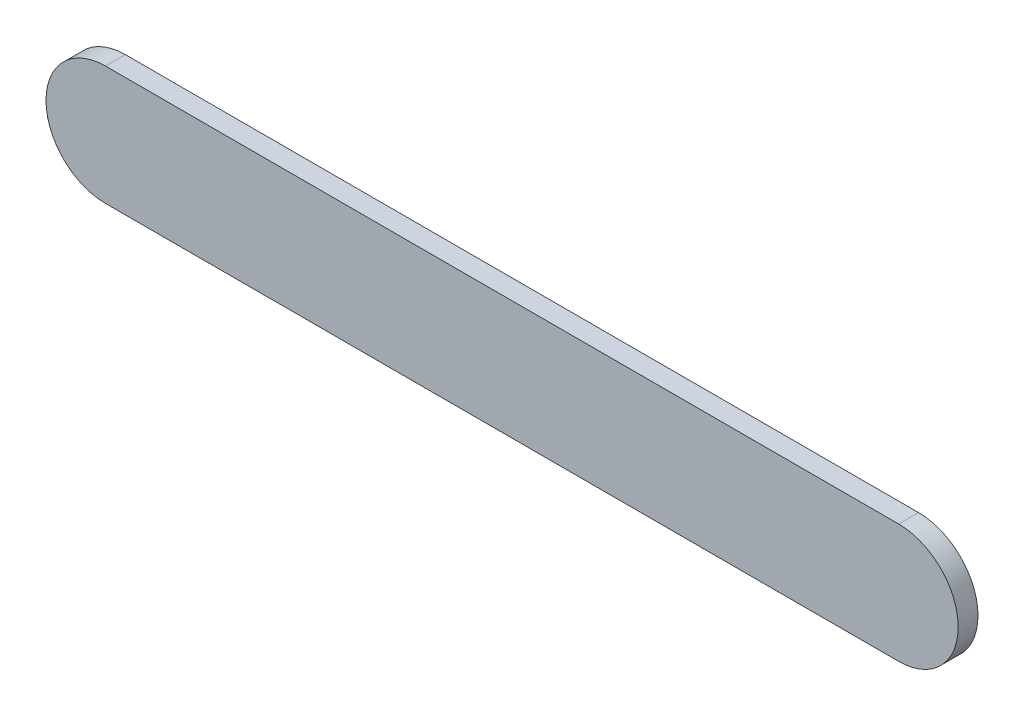
ISO-10303-21;
HEADER;
FILE_DESCRIPTION(('STEP AP214'),'2;1');
FILE_NAME('part.step','',(''),(''),'','','');
FILE_SCHEMA(('AUTOMOTIVE_DESIGN { 1 0 10303 214 1 1 1 1 }'));
ENDSEC;
DATA;
#1=APPLICATION_CONTEXT('core data for automotive mechanical design processes');
#2=APPLICATION_PROTOCOL_DEFINITION('international standard','automotive_design',2000,#1);
#3=PRODUCT_CONTEXT('',#1,'mechanical');
#4=PRODUCT('Part','Part','',(#3));
#5=PRODUCT_RELATED_PRODUCT_CATEGORY('part','',(#4));
#6=PRODUCT_DEFINITION_FORMATION('','',#4);
#7=PRODUCT_DEFINITION_CONTEXT('part definition',#1,'design');
#8=PRODUCT_DEFINITION('design','',#6,#7);
#9=PRODUCT_DEFINITION_SHAPE('','',#8);
#10=(LENGTH_UNIT() NAMED_UNIT(*) SI_UNIT(.MILLI.,.METRE.));
#11=(NAMED_UNIT(*) PLANE_ANGLE_UNIT() SI_UNIT($,.RADIAN.));
#12=(NAMED_UNIT(*) SI_UNIT($,.STERADIAN.) SOLID_ANGLE_UNIT());
#13=UNCERTAINTY_MEASURE_WITH_UNIT(LENGTH_MEASURE(1.E-05),#10,'distance_accuracy_value','');
#14=(GEOMETRIC_REPRESENTATION_CONTEXT(3) GLOBAL_UNCERTAINTY_ASSIGNED_CONTEXT((#13)) GLOBAL_UNIT_ASSIGNED_CONTEXT((#10,
#11,#12)) REPRESENTATION_CONTEXT('',''));
#15=CARTESIAN_POINT('',(0.,0.,0.));
#16=DIRECTION('',(0.,0.,1.));
#17=DIRECTION('',(1.,0.,0.));
#18=AXIS2_PLACEMENT_3D('',#15,#16,#17);
#19=CARTESIAN_POINT('',(400.,0.,10.));
#20=DIRECTION('',(0.,0.,-1.));
#21=DIRECTION('',(-1.,0.,0.));
#22=AXIS2_PLACEMENT_3D('',#19,#20,#21);
#23=CYLINDRICAL_SURFACE('',#22,30.);
#24=CARTESIAN_POINT('',(400.,0.,0.));
#25=DIRECTION('',(0.,0.,1.));
#26=DIRECTION('',(1.,0.,0.));
#27=AXIS2_PLACEMENT_3D('',#24,#25,#26);
#28=CIRCLE('',#27,30.);
#29=CARTESIAN_POINT('',(400.,-30.,0.));
#30=VERTEX_POINT('',#29);
#31=CARTESIAN_POINT('',(400.,30.,0.));
#32=VERTEX_POINT('',#31);
#33=EDGE_CURVE('E112',#30,#32,#28,.T.);
#34=ORIENTED_EDGE('',*,*,#33,.T.);
#35=DIRECTION('',(0.,0.,-1.));
#36=VECTOR('',#35,1.);
#37=CARTESIAN_POINT('',(400.,30.,10.));
#38=LINE('',#37,#36);
#39=CARTESIAN_POINT('',(400.,30.,10.));
#40=VERTEX_POINT('',#39);
#41=EDGE_CURVE('E67',#40,#32,#38,.T.);
#42=ORIENTED_EDGE('',*,*,#41,.F.);
#43=CARTESIAN_POINT('',(400.,0.,10.));
#44=DIRECTION('',(0.,0.,1.));
#45=DIRECTION('',(1.,0.,0.));
#46=AXIS2_PLACEMENT_3D('',#43,#44,#45);
#47=CIRCLE('',#46,30.);
#48=CARTESIAN_POINT('',(400.,-30.,10.));
#49=VERTEX_POINT('',#48);
#50=EDGE_CURVE('E102',#49,#40,#47,.T.);
#51=ORIENTED_EDGE('',*,*,#50,.F.);
#52=DIRECTION('',(0.,0.,-1.));
#53=VECTOR('',#52,1.);
#54=CARTESIAN_POINT('',(400.,-30.,10.));
#55=LINE('',#54,#53);
#56=EDGE_CURVE('E12',#49,#30,#55,.T.);
#57=ORIENTED_EDGE('',*,*,#56,.T.);
#58=EDGE_LOOP('',(#34,#42,#51,#57));
#59=FACE_BOUND('',#58,.T.);
#60=ADVANCED_FACE('F57',(#59),#23,.T.);
#61=CARTESIAN_POINT('',(0.,30.,10.));
#62=DIRECTION('',(0.,1.,0.));
#63=DIRECTION('',(0.,0.,1.));
#64=AXIS2_PLACEMENT_3D('',#61,#62,#63);
#65=PLANE('',#64);
#66=DIRECTION('',(1.,0.,0.));
#67=VECTOR('',#66,1.);
#68=CARTESIAN_POINT('',(0.,30.,0.));
#69=LINE('',#68,#67);
#70=CARTESIAN_POINT('',(0.,30.,0.));
#71=VERTEX_POINT('',#70);
#72=EDGE_CURVE('E127',#71,#32,#69,.T.);
#73=ORIENTED_EDGE('',*,*,#72,.F.);
#74=DIRECTION('',(0.,0.,-1.));
#75=VECTOR('',#74,1.);
#76=CARTESIAN_POINT('',(0.,30.,10.));
#77=LINE('',#76,#75);
#78=CARTESIAN_POINT('',(0.,30.,10.));
#79=VERTEX_POINT('',#78);
#80=EDGE_CURVE('E89',#79,#71,#77,.T.);
#81=ORIENTED_EDGE('',*,*,#80,.F.);
#82=DIRECTION('',(1.,0.,0.));
#83=VECTOR('',#82,1.);
#84=CARTESIAN_POINT('',(0.,30.,10.));
#85=LINE('',#84,#83);
#86=EDGE_CURVE('E106',#79,#40,#85,.T.);
#87=ORIENTED_EDGE('',*,*,#86,.T.);
#88=ORIENTED_EDGE('',*,*,#41,.T.);
#89=EDGE_LOOP('',(#73,#81,#87,#88));
#90=FACE_BOUND('',#89,.T.);
#91=ADVANCED_FACE('F117',(#90),#65,.T.);
#92=CARTESIAN_POINT('',(0.,-30.,10.));
#93=DIRECTION('',(0.,-1.,0.));
#94=DIRECTION('',(0.,0.,-1.));
#95=AXIS2_PLACEMENT_3D('',#92,#93,#94);
#96=PLANE('',#95);
#97=DIRECTION('',(-1.,0.,0.));
#98=VECTOR('',#97,1.);
#99=CARTESIAN_POINT('',(0.,-30.,0.));
#100=LINE('',#99,#98);
#101=CARTESIAN_POINT('',(0.,-30.,0.));
#102=VERTEX_POINT('',#101);
#103=EDGE_CURVE('E122',#30,#102,#100,.T.);
#104=ORIENTED_EDGE('',*,*,#103,.F.);
#105=ORIENTED_EDGE('',*,*,#56,.F.);
#106=DIRECTION('',(-1.,0.,0.));
#107=VECTOR('',#106,1.);
#108=CARTESIAN_POINT('',(0.,-30.,10.));
#109=LINE('',#108,#107);
#110=CARTESIAN_POINT('',(0.,-30.,10.));
#111=VERTEX_POINT('',#110);
#112=EDGE_CURVE('E107',#49,#111,#109,.T.);
#113=ORIENTED_EDGE('',*,*,#112,.T.);
#114=DIRECTION('',(0.,0.,-1.));
#115=VECTOR('',#114,1.);
#116=CARTESIAN_POINT('',(0.,-30.,10.));
#117=LINE('',#116,#115);
#118=EDGE_CURVE('E76',#111,#102,#117,.T.);
#119=ORIENTED_EDGE('',*,*,#118,.T.);
#120=EDGE_LOOP('',(#104,#105,#113,#119));
#121=FACE_BOUND('',#120,.T.);
#122=ADVANCED_FACE('F131',(#121),#96,.T.);
#123=CARTESIAN_POINT('',(0.,0.,0.));
#124=DIRECTION('',(0.,0.,1.));
#125=DIRECTION('',(1.,0.,0.));
#126=AXIS2_PLACEMENT_3D('',#123,#124,#125);
#127=PLANE('',#126);
#128=ORIENTED_EDGE('',*,*,#103,.T.);
#129=CARTESIAN_POINT('',(0.,0.,0.));
#130=DIRECTION('',(0.,0.,1.));
#131=DIRECTION('',(1.,0.,0.));
#132=AXIS2_PLACEMENT_3D('',#129,#130,#131);
#133=CIRCLE('',#132,30.);
#134=EDGE_CURVE('E61',#71,#102,#133,.T.);
#135=ORIENTED_EDGE('',*,*,#134,.F.);
#136=ORIENTED_EDGE('',*,*,#72,.T.);
#137=ORIENTED_EDGE('',*,*,#33,.F.);
#138=EDGE_LOOP('',(#128,#135,#136,#137));
#139=FACE_BOUND('',#138,.T.);
#140=ADVANCED_FACE('F130',(#139),#127,.F.);
#141=CARTESIAN_POINT('',(0.,0.,10.));
#142=DIRECTION('',(0.,0.,1.));
#143=DIRECTION('',(1.,0.,0.));
#144=AXIS2_PLACEMENT_3D('',#141,#142,#143);
#145=PLANE('',#144);
#146=ORIENTED_EDGE('',*,*,#112,.F.);
#147=ORIENTED_EDGE('',*,*,#50,.T.);
#148=ORIENTED_EDGE('',*,*,#86,.F.);
#149=CARTESIAN_POINT('',(0.,0.,10.));
#150=DIRECTION('',(0.,0.,1.));
#151=DIRECTION('',(1.,0.,0.));
#152=AXIS2_PLACEMENT_3D('',#149,#150,#151);
#153=CIRCLE('',#152,30.);
#154=EDGE_CURVE('E125',#79,#111,#153,.T.);
#155=ORIENTED_EDGE('',*,*,#154,.T.);
#156=EDGE_LOOP('',(#146,#147,#148,#155));
#157=FACE_BOUND('',#156,.T.);
#158=ADVANCED_FACE('F104',(#157),#145,.T.);
#159=CARTESIAN_POINT('',(0.,0.,10.));
#160=DIRECTION('',(0.,0.,-1.));
#161=DIRECTION('',(-1.,0.,0.));
#162=AXIS2_PLACEMENT_3D('',#159,#160,#161);
#163=CYLINDRICAL_SURFACE('',#162,30.);
#164=ORIENTED_EDGE('',*,*,#134,.T.);
#165=ORIENTED_EDGE('',*,*,#118,.F.);
#166=ORIENTED_EDGE('',*,*,#154,.F.);
#167=ORIENTED_EDGE('',*,*,#80,.T.);
#168=EDGE_LOOP('',(#164,#165,#166,#167));
#169=FACE_BOUND('',#168,.T.);
#170=ADVANCED_FACE('F59',(#169),#163,.T.);
#171=CLOSED_SHELL('',(#60,#91,#122,#140,#158,#170));
#172=MANIFOLD_SOLID_BREP('B2',#171);
#173=ADVANCED_BREP_SHAPE_REPRESENTATION('',(#18,#172),#14);
#174=SHAPE_DEFINITION_REPRESENTATION(#9,#173);
ENDSEC;
END-ISO-10303-21;
